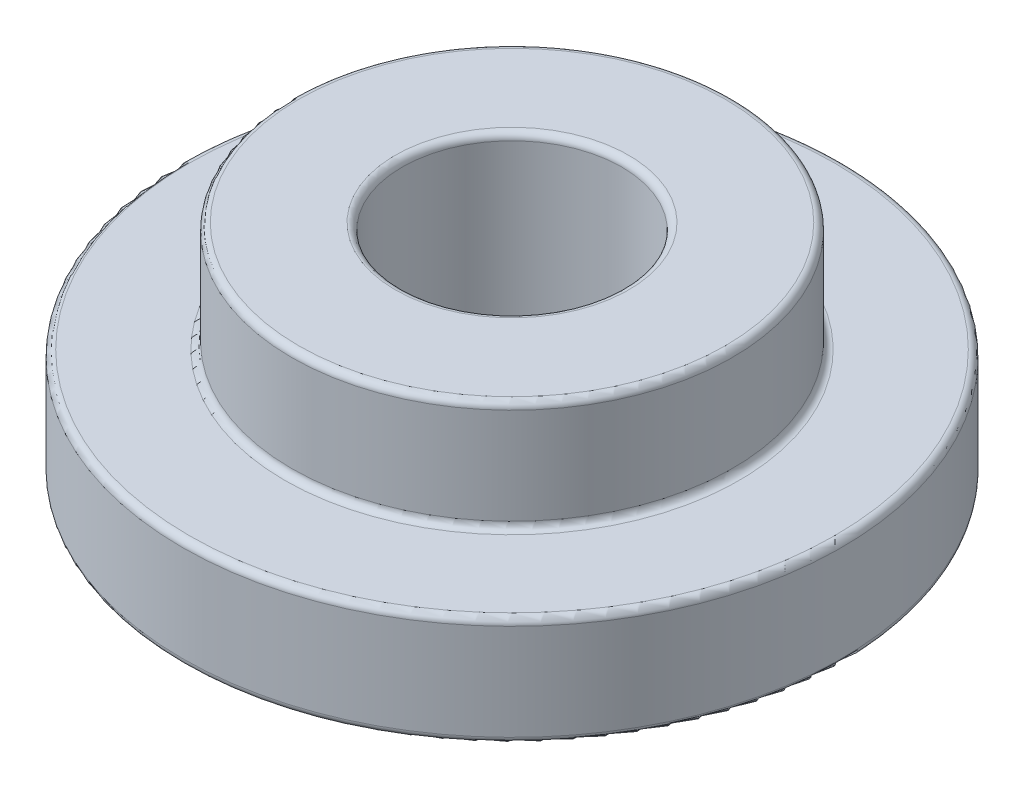
ISO-10303-21;
HEADER;
FILE_DESCRIPTION(('STEP AP214'),'2;1');
FILE_NAME('part.step','',(''),(''),'','','');
FILE_SCHEMA(('AUTOMOTIVE_DESIGN { 1 0 10303 214 1 1 1 1 }'));
ENDSEC;
DATA;
#1=APPLICATION_CONTEXT('core data for automotive mechanical design processes');
#2=APPLICATION_PROTOCOL_DEFINITION('international standard','automotive_design',2000,#1);
#3=PRODUCT_CONTEXT('',#1,'mechanical');
#4=PRODUCT('Part','Part','',(#3));
#5=PRODUCT_RELATED_PRODUCT_CATEGORY('part','',(#4));
#6=PRODUCT_DEFINITION_FORMATION('','',#4);
#7=PRODUCT_DEFINITION_CONTEXT('part definition',#1,'design');
#8=PRODUCT_DEFINITION('design','',#6,#7);
#9=PRODUCT_DEFINITION_SHAPE('','',#8);
#10=(LENGTH_UNIT() NAMED_UNIT(*) SI_UNIT(.MILLI.,.METRE.));
#11=(NAMED_UNIT(*) PLANE_ANGLE_UNIT() SI_UNIT($,.RADIAN.));
#12=(NAMED_UNIT(*) SI_UNIT($,.STERADIAN.) SOLID_ANGLE_UNIT());
#13=UNCERTAINTY_MEASURE_WITH_UNIT(LENGTH_MEASURE(1.E-05),#10,'distance_accuracy_value','');
#14=(GEOMETRIC_REPRESENTATION_CONTEXT(3) GLOBAL_UNCERTAINTY_ASSIGNED_CONTEXT((#13)) GLOBAL_UNIT_ASSIGNED_CONTEXT((#10,
#11,#12)) REPRESENTATION_CONTEXT('',''));
#15=CARTESIAN_POINT('',(0.,0.,0.));
#16=DIRECTION('',(0.,0.,1.));
#17=DIRECTION('',(1.,0.,0.));
#18=AXIS2_PLACEMENT_3D('',#15,#16,#17);
#19=CARTESIAN_POINT('',(0.,4.,0.));
#20=DIRECTION('',(0.,1.,0.));
#21=DIRECTION('',(0.,0.,1.));
#22=AXIS2_PLACEMENT_3D('',#19,#20,#21);
#23=PLANE('',#22);
#24=CARTESIAN_POINT('',(0.,4.,0.));
#25=DIRECTION('',(0.,1.,0.));
#26=DIRECTION('',(0.,0.,1.));
#27=AXIS2_PLACEMENT_3D('',#24,#25,#26);
#28=CIRCLE('',#27,2.125);
#29=CARTESIAN_POINT('',(0.,4.,2.125));
#30=VERTEX_POINT('',#29);
#31=EDGE_CURVE('E10',#30,#30,#28,.F.);
#32=ORIENTED_EDGE('',*,*,#31,.T.);
#33=EDGE_LOOP('',(#32));
#34=FACE_BOUND('',#33,.T.);
#35=CARTESIAN_POINT('',(0.,4.,0.));
#36=DIRECTION('',(0.,1.,0.));
#37=DIRECTION('',(0.,0.,1.));
#38=AXIS2_PLACEMENT_3D('',#35,#36,#37);
#39=CIRCLE('',#38,3.885);
#40=CARTESIAN_POINT('',(0.,4.,3.885));
#41=VERTEX_POINT('',#40);
#42=EDGE_CURVE('E49',#41,#41,#39,.T.);
#43=ORIENTED_EDGE('',*,*,#42,.T.);
#44=EDGE_LOOP('',(#43));
#45=FACE_BOUND('',#44,.T.);
#46=ADVANCED_FACE('F41',(#34,#45),#23,.T.);
#47=CARTESIAN_POINT('',(0.,0.,0.));
#48=DIRECTION('',(0.,1.,0.));
#49=DIRECTION('',(0.,0.,1.));
#50=AXIS2_PLACEMENT_3D('',#47,#48,#49);
#51=PLANE('',#50);
#52=CARTESIAN_POINT('',(0.,0.,0.));
#53=DIRECTION('',(0.,1.,0.));
#54=DIRECTION('',(0.,0.,1.));
#55=AXIS2_PLACEMENT_3D('',#52,#53,#54);
#56=CIRCLE('',#55,2.125);
#57=CARTESIAN_POINT('',(0.,0.,2.125));
#58=VERTEX_POINT('',#57);
#59=EDGE_CURVE('E89',#58,#58,#56,.T.);
#60=ORIENTED_EDGE('',*,*,#59,.T.);
#61=EDGE_LOOP('',(#60));
#62=FACE_BOUND('',#61,.T.);
#63=CARTESIAN_POINT('',(0.,0.,0.));
#64=DIRECTION('',(0.,1.,0.));
#65=DIRECTION('',(0.,0.,1.));
#66=AXIS2_PLACEMENT_3D('',#63,#64,#65);
#67=CIRCLE('',#66,5.875);
#68=CARTESIAN_POINT('',(0.,0.,5.875));
#69=VERTEX_POINT('',#68);
#70=EDGE_CURVE('E93',#69,#69,#67,.F.);
#71=ORIENTED_EDGE('',*,*,#70,.T.);
#72=EDGE_LOOP('',(#71));
#73=FACE_BOUND('',#72,.T.);
#74=ADVANCED_FACE('F98',(#62,#73),#51,.F.);
#75=CARTESIAN_POINT('',(0.,4.,0.));
#76=DIRECTION('',(0.,-1.,0.));
#77=DIRECTION('',(0.,0.,-1.));
#78=AXIS2_PLACEMENT_3D('',#75,#76,#77);
#79=CYLINDRICAL_SURFACE('',#78,4.01);
#80=CARTESIAN_POINT('',(0.,2.125,0.));
#81=DIRECTION('',(0.,1.,0.));
#82=DIRECTION('',(0.,0.,1.));
#83=AXIS2_PLACEMENT_3D('',#80,#81,#82);
#84=CIRCLE('',#83,4.01);
#85=CARTESIAN_POINT('',(0.,2.125,4.01));
#86=VERTEX_POINT('',#85);
#87=EDGE_CURVE('E65',#86,#86,#84,.T.);
#88=ORIENTED_EDGE('',*,*,#87,.T.);
#89=EDGE_LOOP('',(#88));
#90=FACE_BOUND('',#89,.T.);
#91=CARTESIAN_POINT('',(0.,3.875,0.));
#92=DIRECTION('',(0.,1.,0.));
#93=DIRECTION('',(0.,0.,1.));
#94=AXIS2_PLACEMENT_3D('',#91,#92,#93);
#95=CIRCLE('',#94,4.01);
#96=CARTESIAN_POINT('',(0.,3.875,4.01));
#97=VERTEX_POINT('',#96);
#98=EDGE_CURVE('E69',#97,#97,#95,.F.);
#99=ORIENTED_EDGE('',*,*,#98,.T.);
#100=EDGE_LOOP('',(#99));
#101=FACE_BOUND('',#100,.T.);
#102=ADVANCED_FACE('F129',(#90,#101),#79,.T.);
#103=CARTESIAN_POINT('',(0.,4.,0.));
#104=DIRECTION('',(0.,-1.,0.));
#105=DIRECTION('',(0.,0.,-1.));
#106=AXIS2_PLACEMENT_3D('',#103,#104,#105);
#107=CYLINDRICAL_SURFACE('',#106,2.);
#108=CARTESIAN_POINT('',(0.,0.125,0.));
#109=DIRECTION('',(0.,1.,0.));
#110=DIRECTION('',(0.,0.,1.));
#111=AXIS2_PLACEMENT_3D('',#108,#109,#110);
#112=CIRCLE('',#111,2.);
#113=CARTESIAN_POINT('',(0.,0.125,2.));
#114=VERTEX_POINT('',#113);
#115=EDGE_CURVE('E81',#114,#114,#112,.F.);
#116=ORIENTED_EDGE('',*,*,#115,.T.);
#117=EDGE_LOOP('',(#116));
#118=FACE_BOUND('',#117,.T.);
#119=CARTESIAN_POINT('',(0.,3.875,0.));
#120=DIRECTION('',(0.,1.,0.));
#121=DIRECTION('',(0.,0.,1.));
#122=AXIS2_PLACEMENT_3D('',#119,#120,#121);
#123=CIRCLE('',#122,2.);
#124=CARTESIAN_POINT('',(0.,3.875,2.));
#125=VERTEX_POINT('',#124);
#126=EDGE_CURVE('E85',#125,#125,#123,.T.);
#127=ORIENTED_EDGE('',*,*,#126,.T.);
#128=EDGE_LOOP('',(#127));
#129=FACE_BOUND('',#128,.T.);
#130=ADVANCED_FACE('F123',(#118,#129),#107,.F.);
#131=CARTESIAN_POINT('',(0.,2.,0.));
#132=DIRECTION('',(0.,1.,0.));
#133=DIRECTION('',(0.,0.,1.));
#134=AXIS2_PLACEMENT_3D('',#131,#132,#133);
#135=PLANE('',#134);
#136=CARTESIAN_POINT('',(0.,2.,0.));
#137=DIRECTION('',(0.,1.,0.));
#138=DIRECTION('',(0.,0.,1.));
#139=AXIS2_PLACEMENT_3D('',#136,#137,#138);
#140=CIRCLE('',#139,4.135);
#141=CARTESIAN_POINT('',(0.,2.,4.135));
#142=VERTEX_POINT('',#141);
#143=EDGE_CURVE('E54',#142,#142,#140,.F.);
#144=ORIENTED_EDGE('',*,*,#143,.T.);
#145=EDGE_LOOP('',(#144));
#146=FACE_BOUND('',#145,.T.);
#147=CARTESIAN_POINT('',(0.,2.,0.));
#148=DIRECTION('',(0.,1.,0.));
#149=DIRECTION('',(0.,0.,1.));
#150=AXIS2_PLACEMENT_3D('',#147,#148,#149);
#151=CIRCLE('',#150,5.875);
#152=CARTESIAN_POINT('',(0.,2.,5.875));
#153=VERTEX_POINT('',#152);
#154=EDGE_CURVE('E59',#153,#153,#151,.T.);
#155=ORIENTED_EDGE('',*,*,#154,.T.);
#156=EDGE_LOOP('',(#155));
#157=FACE_BOUND('',#156,.T.);
#158=ADVANCED_FACE('F111',(#146,#157),#135,.T.);
#159=CARTESIAN_POINT('',(0.,2.,0.));
#160=DIRECTION('',(0.,-1.,0.));
#161=DIRECTION('',(0.,0.,-1.));
#162=AXIS2_PLACEMENT_3D('',#159,#160,#161);
#163=CYLINDRICAL_SURFACE('',#162,6.);
#164=CARTESIAN_POINT('',(0.,0.125,0.));
#165=DIRECTION('',(0.,1.,0.));
#166=DIRECTION('',(0.,0.,1.));
#167=AXIS2_PLACEMENT_3D('',#164,#165,#166);
#168=CIRCLE('',#167,6.);
#169=CARTESIAN_POINT('',(0.,0.125,6.));
#170=VERTEX_POINT('',#169);
#171=EDGE_CURVE('E73',#170,#170,#168,.T.);
#172=ORIENTED_EDGE('',*,*,#171,.T.);
#173=EDGE_LOOP('',(#172));
#174=FACE_BOUND('',#173,.T.);
#175=CARTESIAN_POINT('',(0.,1.875,0.));
#176=DIRECTION('',(0.,1.,0.));
#177=DIRECTION('',(0.,0.,1.));
#178=AXIS2_PLACEMENT_3D('',#175,#176,#177);
#179=CIRCLE('',#178,6.);
#180=CARTESIAN_POINT('',(0.,1.875,6.));
#181=VERTEX_POINT('',#180);
#182=EDGE_CURVE('E77',#181,#181,#179,.F.);
#183=ORIENTED_EDGE('',*,*,#182,.T.);
#184=EDGE_LOOP('',(#183));
#185=FACE_BOUND('',#184,.T.);
#186=ADVANCED_FACE('F108',(#174,#185),#163,.T.);
#187=CARTESIAN_POINT('',(0.,0.125,0.));
#188=DIRECTION('',(0.,1.,0.));
#189=DIRECTION('',(0.,0.,1.));
#190=AXIS2_PLACEMENT_3D('',#187,#188,#189);
#191=TOROIDAL_SURFACE('',#190,2.125,0.125);
#192=ORIENTED_EDGE('',*,*,#115,.F.);
#193=EDGE_LOOP('',(#192));
#194=FACE_BOUND('',#193,.T.);
#195=ORIENTED_EDGE('',*,*,#59,.F.);
#196=EDGE_LOOP('',(#195));
#197=FACE_BOUND('',#196,.T.);
#198=ADVANCED_FACE('F104',(#194,#197),#191,.T.);
#199=CARTESIAN_POINT('',(0.,0.125,0.));
#200=DIRECTION('',(0.,1.,0.));
#201=DIRECTION('',(0.,0.,1.));
#202=AXIS2_PLACEMENT_3D('',#199,#200,#201);
#203=TOROIDAL_SURFACE('',#202,5.875,0.125);
#204=ORIENTED_EDGE('',*,*,#70,.F.);
#205=EDGE_LOOP('',(#204));
#206=FACE_BOUND('',#205,.T.);
#207=ORIENTED_EDGE('',*,*,#171,.F.);
#208=EDGE_LOOP('',(#207));
#209=FACE_BOUND('',#208,.T.);
#210=ADVANCED_FACE('F100',(#206,#209),#203,.T.);
#211=CARTESIAN_POINT('',(0.,2.125,0.));
#212=DIRECTION('',(0.,1.,0.));
#213=DIRECTION('',(0.,0.,1.));
#214=AXIS2_PLACEMENT_3D('',#211,#212,#213);
#215=TOROIDAL_SURFACE('',#214,4.135,0.125);
#216=ORIENTED_EDGE('',*,*,#143,.F.);
#217=EDGE_LOOP('',(#216));
#218=FACE_BOUND('',#217,.T.);
#219=ORIENTED_EDGE('',*,*,#87,.F.);
#220=EDGE_LOOP('',(#219));
#221=FACE_BOUND('',#220,.T.);
#222=ADVANCED_FACE('F103',(#218,#221),#215,.F.);
#223=CARTESIAN_POINT('',(0.,1.875,0.));
#224=DIRECTION('',(0.,1.,0.));
#225=DIRECTION('',(0.,0.,1.));
#226=AXIS2_PLACEMENT_3D('',#223,#224,#225);
#227=TOROIDAL_SURFACE('',#226,5.875,0.125);
#228=ORIENTED_EDGE('',*,*,#182,.F.);
#229=EDGE_LOOP('',(#228));
#230=FACE_BOUND('',#229,.T.);
#231=ORIENTED_EDGE('',*,*,#154,.F.);
#232=EDGE_LOOP('',(#231));
#233=FACE_BOUND('',#232,.T.);
#234=ADVANCED_FACE('F115',(#230,#233),#227,.T.);
#235=CARTESIAN_POINT('',(0.,3.875,0.));
#236=DIRECTION('',(0.,1.,0.));
#237=DIRECTION('',(0.,0.,1.));
#238=AXIS2_PLACEMENT_3D('',#235,#236,#237);
#239=TOROIDAL_SURFACE('',#238,2.125,0.125);
#240=ORIENTED_EDGE('',*,*,#31,.F.);
#241=EDGE_LOOP('',(#240));
#242=FACE_BOUND('',#241,.T.);
#243=ORIENTED_EDGE('',*,*,#126,.F.);
#244=EDGE_LOOP('',(#243));
#245=FACE_BOUND('',#244,.T.);
#246=ADVANCED_FACE('F118',(#242,#245),#239,.T.);
#247=CARTESIAN_POINT('',(0.,3.875,0.));
#248=DIRECTION('',(0.,1.,0.));
#249=DIRECTION('',(0.,0.,1.));
#250=AXIS2_PLACEMENT_3D('',#247,#248,#249);
#251=TOROIDAL_SURFACE('',#250,3.885,0.125);
#252=ORIENTED_EDGE('',*,*,#98,.F.);
#253=EDGE_LOOP('',(#252));
#254=FACE_BOUND('',#253,.T.);
#255=ORIENTED_EDGE('',*,*,#42,.F.);
#256=EDGE_LOOP('',(#255));
#257=FACE_BOUND('',#256,.T.);
#258=ADVANCED_FACE('F43',(#254,#257),#251,.T.);
#259=CLOSED_SHELL('',(#46,#74,#102,#130,#158,#186,#198,#210,#222,#234,#246,#258));
#260=MANIFOLD_SOLID_BREP('B2',#259);
#261=ADVANCED_BREP_SHAPE_REPRESENTATION('',(#18,#260),#14);
#262=SHAPE_DEFINITION_REPRESENTATION(#9,#261);
ENDSEC;
END-ISO-10303-21;
